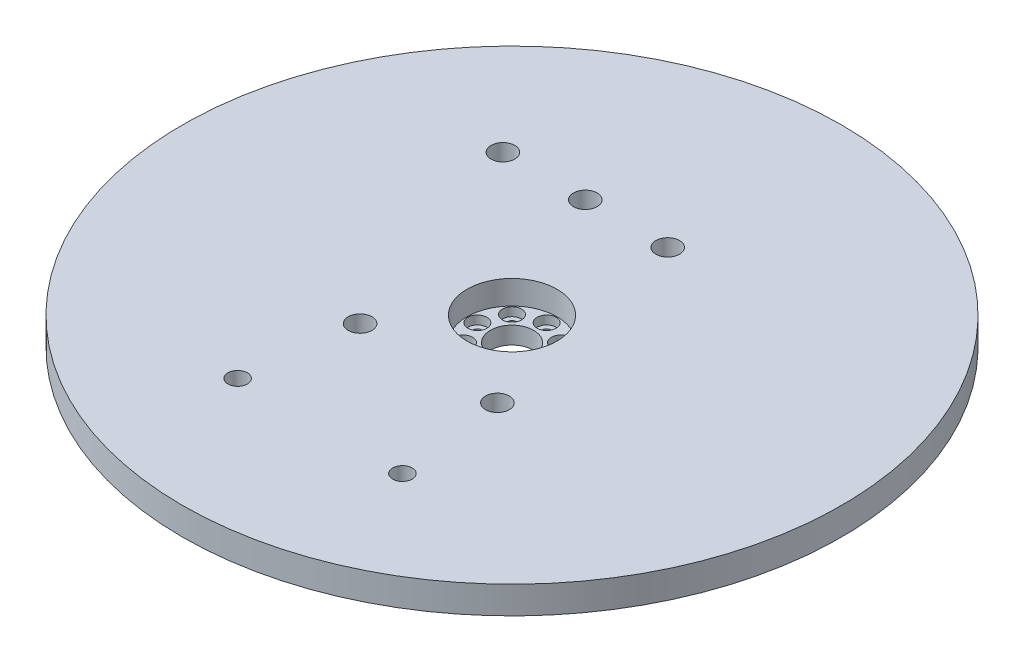
ISO-10303-21;
HEADER;
FILE_DESCRIPTION(('STEP AP214'),'2;1');
FILE_NAME('part.step','',(''),(''),'','','');
FILE_SCHEMA(('AUTOMOTIVE_DESIGN { 1 0 10303 214 1 1 1 1 }'));
ENDSEC;
DATA;
#1=APPLICATION_CONTEXT('core data for automotive mechanical design processes');
#2=APPLICATION_PROTOCOL_DEFINITION('international standard','automotive_design',2000,#1);
#3=PRODUCT_CONTEXT('',#1,'mechanical');
#4=PRODUCT('Part','Part','',(#3));
#5=PRODUCT_RELATED_PRODUCT_CATEGORY('part','',(#4));
#6=PRODUCT_DEFINITION_FORMATION('','',#4);
#7=PRODUCT_DEFINITION_CONTEXT('part definition',#1,'design');
#8=PRODUCT_DEFINITION('design','',#6,#7);
#9=PRODUCT_DEFINITION_SHAPE('','',#8);
#10=(LENGTH_UNIT() NAMED_UNIT(*) SI_UNIT(.MILLI.,.METRE.));
#11=(NAMED_UNIT(*) PLANE_ANGLE_UNIT() SI_UNIT($,.RADIAN.));
#12=(NAMED_UNIT(*) SI_UNIT($,.STERADIAN.) SOLID_ANGLE_UNIT());
#13=UNCERTAINTY_MEASURE_WITH_UNIT(LENGTH_MEASURE(1.E-05),#10,'distance_accuracy_value','');
#14=(GEOMETRIC_REPRESENTATION_CONTEXT(3) GLOBAL_UNCERTAINTY_ASSIGNED_CONTEXT((#13)) GLOBAL_UNIT_ASSIGNED_CONTEXT((#10,
#11,#12)) REPRESENTATION_CONTEXT('',''));
#15=CARTESIAN_POINT('',(0.,0.,0.));
#16=DIRECTION('',(0.,0.,1.));
#17=DIRECTION('',(1.,0.,0.));
#18=AXIS2_PLACEMENT_3D('',#15,#16,#17);
#19=CARTESIAN_POINT('',(0.,3.175,0.));
#20=DIRECTION('',(0.,-1.,0.));
#21=DIRECTION('',(0.,0.,-1.));
#22=AXIS2_PLACEMENT_3D('',#19,#20,#21);
#23=CYLINDRICAL_SURFACE('',#22,76.2);
#24=CARTESIAN_POINT('',(0.,3.175,0.));
#25=DIRECTION('',(0.,1.,0.));
#26=DIRECTION('',(0.,0.,1.));
#27=AXIS2_PLACEMENT_3D('',#24,#25,#26);
#28=CIRCLE('',#27,76.2);
#29=CARTESIAN_POINT('',(0.,3.175,76.2));
#30=VERTEX_POINT('',#29);
#31=EDGE_CURVE('E46',#30,#30,#28,.T.);
#32=ORIENTED_EDGE('',*,*,#31,.F.);
#33=EDGE_LOOP('',(#32));
#34=FACE_BOUND('',#33,.T.);
#35=CARTESIAN_POINT('',(0.,-3.175,0.));
#36=DIRECTION('',(0.,1.,0.));
#37=DIRECTION('',(0.,0.,1.));
#38=AXIS2_PLACEMENT_3D('',#35,#36,#37);
#39=CIRCLE('',#38,76.2);
#40=CARTESIAN_POINT('',(0.,-3.175,76.2));
#41=VERTEX_POINT('',#40);
#42=EDGE_CURVE('E51',#41,#41,#39,.T.);
#43=ORIENTED_EDGE('',*,*,#42,.T.);
#44=EDGE_LOOP('',(#43));
#45=FACE_BOUND('',#44,.T.);
#46=ADVANCED_FACE('F39',(#34,#45),#23,.T.);
#47=CARTESIAN_POINT('',(0.,3.175,0.));
#48=DIRECTION('',(0.,1.,0.));
#49=DIRECTION('',(0.,0.,1.));
#50=AXIS2_PLACEMENT_3D('',#47,#48,#49);
#51=PLANE('',#50);
#52=CARTESIAN_POINT('',(-33.6688086,3.175,-31.5673879519193));
#53=DIRECTION('',(0.,1.,0.));
#54=DIRECTION('',(0.,0.,1.));
#55=AXIS2_PLACEMENT_3D('',#52,#53,#54);
#56=CIRCLE('',#55,2.75);
#57=CARTESIAN_POINT('',(-33.6688086,3.175,-28.8173879519193));
#58=VERTEX_POINT('',#57);
#59=EDGE_CURVE('E117',#58,#58,#56,.T.);
#60=ORIENTED_EDGE('',*,*,#59,.F.);
#61=EDGE_LOOP('',(#60));
#62=FACE_BOUND('',#61,.T.);
#63=CARTESIAN_POINT('',(-14.6188085999999,3.175,-31.5673879519193));
#64=DIRECTION('',(0.,1.,0.));
#65=DIRECTION('',(0.,0.,1.));
#66=AXIS2_PLACEMENT_3D('',#63,#64,#65);
#67=CIRCLE('',#66,2.75);
#68=CARTESIAN_POINT('',(-14.6188085999999,3.175,-28.8173879519193));
#69=VERTEX_POINT('',#68);
#70=EDGE_CURVE('E106',#69,#69,#67,.T.);
#71=ORIENTED_EDGE('',*,*,#70,.F.);
#72=EDGE_LOOP('',(#71));
#73=FACE_BOUND('',#72,.T.);
#74=CARTESIAN_POINT('',(4.43119140000003,3.175,-31.5673879519193));
#75=DIRECTION('',(0.,1.,0.));
#76=DIRECTION('',(0.,0.,1.));
#77=AXIS2_PLACEMENT_3D('',#74,#75,#76);
#78=CIRCLE('',#77,2.75);
#79=CARTESIAN_POINT('',(4.43119140000003,3.175,-28.8173879519193));
#80=VERTEX_POINT('',#79);
#81=EDGE_CURVE('E105',#80,#80,#78,.T.);
#82=ORIENTED_EDGE('',*,*,#81,.F.);
#83=EDGE_LOOP('',(#82));
#84=FACE_BOUND('',#83,.T.);
#85=CARTESIAN_POINT('',(-15.875,3.175,19.2497064480786));
#86=DIRECTION('',(0.,1.,0.));
#87=DIRECTION('',(0.,0.,1.));
#88=AXIS2_PLACEMENT_3D('',#85,#86,#87);
#89=CIRCLE('',#88,2.75);
#90=CARTESIAN_POINT('',(-15.875,3.175,21.9997064480786));
#91=VERTEX_POINT('',#90);
#92=EDGE_CURVE('E122',#91,#91,#89,.T.);
#93=ORIENTED_EDGE('',*,*,#92,.F.);
#94=EDGE_LOOP('',(#93));
#95=FACE_BOUND('',#94,.T.);
#96=CARTESIAN_POINT('',(15.875,3.175,19.2497064480786));
#97=DIRECTION('',(0.,1.,0.));
#98=DIRECTION('',(0.,0.,1.));
#99=AXIS2_PLACEMENT_3D('',#96,#97,#98);
#100=CIRCLE('',#99,2.75);
#101=CARTESIAN_POINT('',(15.875,3.175,21.9997064480786));
#102=VERTEX_POINT('',#101);
#103=EDGE_CURVE('E102',#102,#102,#100,.T.);
#104=ORIENTED_EDGE('',*,*,#103,.F.);
#105=EDGE_LOOP('',(#104));
#106=FACE_BOUND('',#105,.T.);
#107=CARTESIAN_POINT('',(19.0500000000001,3.175,44.3882120480786));
#108=DIRECTION('',(0.,1.,0.));
#109=DIRECTION('',(0.,0.,1.));
#110=AXIS2_PLACEMENT_3D('',#107,#108,#109);
#111=CIRCLE('',#110,2.25);
#112=CARTESIAN_POINT('',(19.0500000000001,3.175,46.6382120480786));
#113=VERTEX_POINT('',#112);
#114=EDGE_CURVE('E101',#113,#113,#111,.T.);
#115=ORIENTED_EDGE('',*,*,#114,.F.);
#116=EDGE_LOOP('',(#115));
#117=FACE_BOUND('',#116,.T.);
#118=CARTESIAN_POINT('',(-19.0499999999999,3.175,44.3882120480786));
#119=DIRECTION('',(0.,1.,0.));
#120=DIRECTION('',(0.,0.,1.));
#121=AXIS2_PLACEMENT_3D('',#118,#119,#120);
#122=CIRCLE('',#121,2.25);
#123=CARTESIAN_POINT('',(-19.0499999999999,3.175,46.6382120480786));
#124=VERTEX_POINT('',#123);
#125=EDGE_CURVE('E135',#124,#124,#122,.T.);
#126=ORIENTED_EDGE('',*,*,#125,.F.);
#127=EDGE_LOOP('',(#126));
#128=FACE_BOUND('',#127,.T.);
#129=CARTESIAN_POINT('',(0.,3.175,0.));
#130=DIRECTION('',(0.,1.,0.));
#131=DIRECTION('',(0.,0.,1.));
#132=AXIS2_PLACEMENT_3D('',#129,#130,#131);
#133=CIRCLE('',#132,10.4);
#134=CARTESIAN_POINT('',(0.,3.175,10.4));
#135=VERTEX_POINT('',#134);
#136=EDGE_CURVE('E201',#135,#135,#133,.T.);
#137=ORIENTED_EDGE('',*,*,#136,.F.);
#138=EDGE_LOOP('',(#137));
#139=FACE_BOUND('',#138,.T.);
#140=ORIENTED_EDGE('',*,*,#31,.T.);
#141=EDGE_LOOP('',(#140));
#142=FACE_BOUND('',#141,.T.);
#143=ADVANCED_FACE('F226',(#62,#73,#84,#95,#106,#117,#128,#139,#142),#51,.T.);
#144=CARTESIAN_POINT('',(0.,-3.175,0.));
#145=DIRECTION('',(0.,1.,0.));
#146=DIRECTION('',(0.,0.,1.));
#147=AXIS2_PLACEMENT_3D('',#144,#145,#146);
#148=PLANE('',#147);
#149=CARTESIAN_POINT('',(-33.6688086,-3.175,-31.5673879519193));
#150=DIRECTION('',(0.,1.,0.));
#151=DIRECTION('',(0.,0.,1.));
#152=AXIS2_PLACEMENT_3D('',#149,#150,#151);
#153=CIRCLE('',#152,2.75);
#154=CARTESIAN_POINT('',(-33.6688086,-3.175,-28.8173879519193));
#155=VERTEX_POINT('',#154);
#156=EDGE_CURVE('E42',#155,#155,#153,.T.);
#157=ORIENTED_EDGE('',*,*,#156,.T.);
#158=EDGE_LOOP('',(#157));
#159=FACE_BOUND('',#158,.T.);
#160=CARTESIAN_POINT('',(-14.6188085999999,-3.175,-31.5673879519193));
#161=DIRECTION('',(0.,1.,0.));
#162=DIRECTION('',(0.,0.,1.));
#163=AXIS2_PLACEMENT_3D('',#160,#161,#162);
#164=CIRCLE('',#163,2.75);
#165=CARTESIAN_POINT('',(-14.6188085999999,-3.175,-28.8173879519193));
#166=VERTEX_POINT('',#165);
#167=EDGE_CURVE('E103',#166,#166,#164,.T.);
#168=ORIENTED_EDGE('',*,*,#167,.T.);
#169=EDGE_LOOP('',(#168));
#170=FACE_BOUND('',#169,.T.);
#171=CARTESIAN_POINT('',(4.43119140000003,-3.175,-31.5673879519193));
#172=DIRECTION('',(0.,1.,0.));
#173=DIRECTION('',(0.,0.,1.));
#174=AXIS2_PLACEMENT_3D('',#171,#172,#173);
#175=CIRCLE('',#174,2.75);
#176=CARTESIAN_POINT('',(4.43119140000003,-3.175,-28.8173879519193));
#177=VERTEX_POINT('',#176);
#178=EDGE_CURVE('E110',#177,#177,#175,.T.);
#179=ORIENTED_EDGE('',*,*,#178,.T.);
#180=EDGE_LOOP('',(#179));
#181=FACE_BOUND('',#180,.T.);
#182=CARTESIAN_POINT('',(-15.875,-3.175,19.2497064480786));
#183=DIRECTION('',(0.,1.,0.));
#184=DIRECTION('',(0.,0.,1.));
#185=AXIS2_PLACEMENT_3D('',#182,#183,#184);
#186=CIRCLE('',#185,2.75);
#187=CARTESIAN_POINT('',(-15.875,-3.175,21.9997064480786));
#188=VERTEX_POINT('',#187);
#189=EDGE_CURVE('E125',#188,#188,#186,.T.);
#190=ORIENTED_EDGE('',*,*,#189,.T.);
#191=EDGE_LOOP('',(#190));
#192=FACE_BOUND('',#191,.T.);
#193=CARTESIAN_POINT('',(15.875,-3.175,19.2497064480786));
#194=DIRECTION('',(0.,1.,0.));
#195=DIRECTION('',(0.,0.,1.));
#196=AXIS2_PLACEMENT_3D('',#193,#194,#195);
#197=CIRCLE('',#196,2.75);
#198=CARTESIAN_POINT('',(15.875,-3.175,21.9997064480786));
#199=VERTEX_POINT('',#198);
#200=EDGE_CURVE('E99',#199,#199,#197,.T.);
#201=ORIENTED_EDGE('',*,*,#200,.T.);
#202=EDGE_LOOP('',(#201));
#203=FACE_BOUND('',#202,.T.);
#204=CARTESIAN_POINT('',(19.0500000000001,-3.175,44.3882120480786));
#205=DIRECTION('',(0.,1.,0.));
#206=DIRECTION('',(0.,0.,1.));
#207=AXIS2_PLACEMENT_3D('',#204,#205,#206);
#208=CIRCLE('',#207,2.25);
#209=CARTESIAN_POINT('',(19.0500000000001,-3.175,46.6382120480786));
#210=VERTEX_POINT('',#209);
#211=EDGE_CURVE('E132',#210,#210,#208,.T.);
#212=ORIENTED_EDGE('',*,*,#211,.T.);
#213=EDGE_LOOP('',(#212));
#214=FACE_BOUND('',#213,.T.);
#215=CARTESIAN_POINT('',(-19.0499999999999,-3.175,44.3882120480786));
#216=DIRECTION('',(0.,1.,0.));
#217=DIRECTION('',(0.,0.,1.));
#218=AXIS2_PLACEMENT_3D('',#215,#216,#217);
#219=CIRCLE('',#218,2.25);
#220=CARTESIAN_POINT('',(-19.0499999999999,-3.175,46.6382120480786));
#221=VERTEX_POINT('',#220);
#222=EDGE_CURVE('E138',#221,#221,#219,.T.);
#223=ORIENTED_EDGE('',*,*,#222,.T.);
#224=EDGE_LOOP('',(#223));
#225=FACE_BOUND('',#224,.T.);
#226=CARTESIAN_POINT('',(0.,-3.175,0.));
#227=DIRECTION('',(0.,-1.,0.));
#228=DIRECTION('',(0.,0.,-1.));
#229=AXIS2_PLACEMENT_3D('',#226,#227,#228);
#230=CIRCLE('',#229,12.065);
#231=CARTESIAN_POINT('',(0.,-3.175,-12.065));
#232=VERTEX_POINT('',#231);
#233=EDGE_CURVE('E11',#232,#232,#230,.T.);
#234=ORIENTED_EDGE('',*,*,#233,.F.);
#235=EDGE_LOOP('',(#234));
#236=FACE_BOUND('',#235,.T.);
#237=ORIENTED_EDGE('',*,*,#42,.F.);
#238=EDGE_LOOP('',(#237));
#239=FACE_BOUND('',#238,.T.);
#240=ADVANCED_FACE('F216',(#159,#170,#181,#192,#203,#214,#225,#236,#239),#148,.F.);
#241=CARTESIAN_POINT('',(0.,-6.35,0.));
#242=DIRECTION('',(0.,1.,0.));
#243=DIRECTION('',(0.,0.,1.));
#244=AXIS2_PLACEMENT_3D('',#241,#242,#243);
#245=CYLINDRICAL_SURFACE('',#244,12.065);
#246=CARTESIAN_POINT('',(0.,-6.35,0.));
#247=DIRECTION('',(0.,-1.,0.));
#248=DIRECTION('',(0.,0.,-1.));
#249=AXIS2_PLACEMENT_3D('',#246,#247,#248);
#250=CIRCLE('',#249,12.065);
#251=CARTESIAN_POINT('',(0.,-6.35,-12.065));
#252=VERTEX_POINT('',#251);
#253=EDGE_CURVE('E54',#252,#252,#250,.T.);
#254=ORIENTED_EDGE('',*,*,#253,.F.);
#255=EDGE_LOOP('',(#254));
#256=FACE_BOUND('',#255,.T.);
#257=ORIENTED_EDGE('',*,*,#233,.T.);
#258=EDGE_LOOP('',(#257));
#259=FACE_BOUND('',#258,.T.);
#260=ADVANCED_FACE('F214',(#256,#259),#245,.T.);
#261=CARTESIAN_POINT('',(0.,-6.35,0.));
#262=DIRECTION('',(0.,-1.,0.));
#263=DIRECTION('',(0.,0.,-1.));
#264=AXIS2_PLACEMENT_3D('',#261,#262,#263);
#265=PLANE('',#264);
#266=CARTESIAN_POINT('',(-5.6568542495,-6.35,-5.6568542495));
#267=DIRECTION('',(0.,-1.,0.));
#268=DIRECTION('',(0.,0.,-1.));
#269=AXIS2_PLACEMENT_3D('',#266,#267,#268);
#270=CIRCLE('',#269,1.1);
#271=CARTESIAN_POINT('',(-5.6568542495,-6.35,-6.7568542495));
#272=VERTEX_POINT('',#271);
#273=EDGE_CURVE('E94',#272,#272,#270,.T.);
#274=ORIENTED_EDGE('',*,*,#273,.F.);
#275=EDGE_LOOP('',(#274));
#276=FACE_BOUND('',#275,.T.);
#277=CARTESIAN_POINT('',(0.,-6.35,-8.));
#278=DIRECTION('',(0.,-1.,0.));
#279=DIRECTION('',(0.,0.,-1.));
#280=AXIS2_PLACEMENT_3D('',#277,#278,#279);
#281=CIRCLE('',#280,1.1);
#282=CARTESIAN_POINT('',(0.,-6.35,-9.1));
#283=VERTEX_POINT('',#282);
#284=EDGE_CURVE('E89',#283,#283,#281,.T.);
#285=ORIENTED_EDGE('',*,*,#284,.F.);
#286=EDGE_LOOP('',(#285));
#287=FACE_BOUND('',#286,.T.);
#288=CARTESIAN_POINT('',(5.6568542495,-6.35,-5.6568542495));
#289=DIRECTION('',(0.,-1.,0.));
#290=DIRECTION('',(0.,0.,-1.));
#291=AXIS2_PLACEMENT_3D('',#288,#289,#290);
#292=CIRCLE('',#291,1.1);
#293=CARTESIAN_POINT('',(5.6568542495,-6.35,-6.7568542495));
#294=VERTEX_POINT('',#293);
#295=EDGE_CURVE('E84',#294,#294,#292,.T.);
#296=ORIENTED_EDGE('',*,*,#295,.F.);
#297=EDGE_LOOP('',(#296));
#298=FACE_BOUND('',#297,.T.);
#299=CARTESIAN_POINT('',(8.,-6.35,0.));
#300=DIRECTION('',(0.,-1.,0.));
#301=DIRECTION('',(0.,0.,-1.));
#302=AXIS2_PLACEMENT_3D('',#299,#300,#301);
#303=CIRCLE('',#302,1.1);
#304=CARTESIAN_POINT('',(8.,-6.35,-1.1));
#305=VERTEX_POINT('',#304);
#306=EDGE_CURVE('E79',#305,#305,#303,.T.);
#307=ORIENTED_EDGE('',*,*,#306,.F.);
#308=EDGE_LOOP('',(#307));
#309=FACE_BOUND('',#308,.T.);
#310=CARTESIAN_POINT('',(5.6568542495,-6.35,5.6568542495));
#311=DIRECTION('',(0.,-1.,0.));
#312=DIRECTION('',(0.,0.,-1.));
#313=AXIS2_PLACEMENT_3D('',#310,#311,#312);
#314=CIRCLE('',#313,1.1);
#315=CARTESIAN_POINT('',(5.6568542495,-6.35,4.5568542495));
#316=VERTEX_POINT('',#315);
#317=EDGE_CURVE('E74',#316,#316,#314,.T.);
#318=ORIENTED_EDGE('',*,*,#317,.F.);
#319=EDGE_LOOP('',(#318));
#320=FACE_BOUND('',#319,.T.);
#321=CARTESIAN_POINT('',(0.,-6.35,8.));
#322=DIRECTION('',(0.,-1.,0.));
#323=DIRECTION('',(0.,0.,-1.));
#324=AXIS2_PLACEMENT_3D('',#321,#322,#323);
#325=CIRCLE('',#324,1.1);
#326=CARTESIAN_POINT('',(0.,-6.35,6.9));
#327=VERTEX_POINT('',#326);
#328=EDGE_CURVE('E69',#327,#327,#325,.T.);
#329=ORIENTED_EDGE('',*,*,#328,.F.);
#330=EDGE_LOOP('',(#329));
#331=FACE_BOUND('',#330,.T.);
#332=CARTESIAN_POINT('',(-5.6568542495,-6.35,5.6568542495));
#333=DIRECTION('',(0.,-1.,0.));
#334=DIRECTION('',(0.,0.,-1.));
#335=AXIS2_PLACEMENT_3D('',#332,#333,#334);
#336=CIRCLE('',#335,1.1);
#337=CARTESIAN_POINT('',(-5.6568542495,-6.35,4.5568542495));
#338=VERTEX_POINT('',#337);
#339=EDGE_CURVE('E64',#338,#338,#336,.T.);
#340=ORIENTED_EDGE('',*,*,#339,.F.);
#341=EDGE_LOOP('',(#340));
#342=FACE_BOUND('',#341,.T.);
#343=CARTESIAN_POINT('',(-8.,-6.35,0.));
#344=DIRECTION('',(0.,-1.,0.));
#345=DIRECTION('',(0.,0.,-1.));
#346=AXIS2_PLACEMENT_3D('',#343,#344,#345);
#347=CIRCLE('',#346,1.1);
#348=CARTESIAN_POINT('',(-8.,-6.35,-1.1));
#349=VERTEX_POINT('',#348);
#350=EDGE_CURVE('E59',#349,#349,#347,.T.);
#351=ORIENTED_EDGE('',*,*,#350,.F.);
#352=EDGE_LOOP('',(#351));
#353=FACE_BOUND('',#352,.T.);
#354=CARTESIAN_POINT('',(0.,-6.35,0.));
#355=DIRECTION('',(0.,-1.,0.));
#356=DIRECTION('',(0.,0.,-1.));
#357=AXIS2_PLACEMENT_3D('',#354,#355,#356);
#358=CIRCLE('',#357,5.);
#359=CARTESIAN_POINT('',(0.,-6.35,-5.));
#360=VERTEX_POINT('',#359);
#361=EDGE_CURVE('E62',#360,#360,#358,.F.);
#362=ORIENTED_EDGE('',*,*,#361,.T.);
#363=EDGE_LOOP('',(#362));
#364=FACE_BOUND('',#363,.T.);
#365=ORIENTED_EDGE('',*,*,#253,.T.);
#366=EDGE_LOOP('',(#365));
#367=FACE_BOUND('',#366,.T.);
#368=ADVANCED_FACE('F212',(#276,#287,#298,#309,#320,#331,#342,#353,#364,#367),#265,.T.);
#369=CARTESIAN_POINT('',(0.,-2.35,0.));
#370=DIRECTION('',(0.,-1.,0.));
#371=DIRECTION('',(0.,0.,-1.));
#372=AXIS2_PLACEMENT_3D('',#369,#370,#371);
#373=PLANE('',#372);
#374=CARTESIAN_POINT('',(-5.6568542495,-2.35,-5.6568542495));
#375=DIRECTION('',(0.,1.,0.));
#376=DIRECTION('',(0.,0.,1.));
#377=AXIS2_PLACEMENT_3D('',#374,#375,#376);
#378=CIRCLE('',#377,2.19999999999999);
#379=CARTESIAN_POINT('',(-5.6568542495,-2.35,-3.45685424950001));
#380=VERTEX_POINT('',#379);
#381=EDGE_CURVE('E141',#380,#380,#378,.T.);
#382=ORIENTED_EDGE('',*,*,#381,.F.);
#383=EDGE_LOOP('',(#382));
#384=FACE_BOUND('',#383,.T.);
#385=CARTESIAN_POINT('',(0.,-2.35,-8.));
#386=DIRECTION('',(0.,1.,0.));
#387=DIRECTION('',(0.,0.,1.));
#388=AXIS2_PLACEMENT_3D('',#385,#386,#387);
#389=CIRCLE('',#388,2.19999999999999);
#390=CARTESIAN_POINT('',(0.,-2.35,-5.80000000000001));
#391=VERTEX_POINT('',#390);
#392=EDGE_CURVE('E97',#391,#391,#389,.T.);
#393=ORIENTED_EDGE('',*,*,#392,.F.);
#394=EDGE_LOOP('',(#393));
#395=FACE_BOUND('',#394,.T.);
#396=CARTESIAN_POINT('',(5.6568542495,-2.35,-5.6568542495));
#397=DIRECTION('',(0.,1.,0.));
#398=DIRECTION('',(0.,0.,1.));
#399=AXIS2_PLACEMENT_3D('',#396,#397,#398);
#400=CIRCLE('',#399,2.19999999999999);
#401=CARTESIAN_POINT('',(5.6568542495,-2.35,-3.45685424950001));
#402=VERTEX_POINT('',#401);
#403=EDGE_CURVE('E92',#402,#402,#400,.T.);
#404=ORIENTED_EDGE('',*,*,#403,.F.);
#405=EDGE_LOOP('',(#404));
#406=FACE_BOUND('',#405,.T.);
#407=CARTESIAN_POINT('',(8.,-2.35,0.));
#408=DIRECTION('',(0.,1.,0.));
#409=DIRECTION('',(0.,0.,1.));
#410=AXIS2_PLACEMENT_3D('',#407,#408,#409);
#411=CIRCLE('',#410,2.19999999999999);
#412=CARTESIAN_POINT('',(8.,-2.35,2.19999999999999));
#413=VERTEX_POINT('',#412);
#414=EDGE_CURVE('E87',#413,#413,#411,.T.);
#415=ORIENTED_EDGE('',*,*,#414,.F.);
#416=EDGE_LOOP('',(#415));
#417=FACE_BOUND('',#416,.T.);
#418=CARTESIAN_POINT('',(5.6568542495,-2.35,5.6568542495));
#419=DIRECTION('',(0.,1.,0.));
#420=DIRECTION('',(0.,0.,1.));
#421=AXIS2_PLACEMENT_3D('',#418,#419,#420);
#422=CIRCLE('',#421,2.19999999999999);
#423=CARTESIAN_POINT('',(5.6568542495,-2.35,7.85685424949999));
#424=VERTEX_POINT('',#423);
#425=EDGE_CURVE('E82',#424,#424,#422,.T.);
#426=ORIENTED_EDGE('',*,*,#425,.F.);
#427=EDGE_LOOP('',(#426));
#428=FACE_BOUND('',#427,.T.);
#429=CARTESIAN_POINT('',(0.,-2.35,8.));
#430=DIRECTION('',(0.,1.,0.));
#431=DIRECTION('',(0.,0.,1.));
#432=AXIS2_PLACEMENT_3D('',#429,#430,#431);
#433=CIRCLE('',#432,2.19999999999999);
#434=CARTESIAN_POINT('',(0.,-2.35,10.2));
#435=VERTEX_POINT('',#434);
#436=EDGE_CURVE('E77',#435,#435,#433,.T.);
#437=ORIENTED_EDGE('',*,*,#436,.F.);
#438=EDGE_LOOP('',(#437));
#439=FACE_BOUND('',#438,.T.);
#440=CARTESIAN_POINT('',(-5.6568542495,-2.35,5.6568542495));
#441=DIRECTION('',(0.,1.,0.));
#442=DIRECTION('',(0.,0.,1.));
#443=AXIS2_PLACEMENT_3D('',#440,#441,#442);
#444=CIRCLE('',#443,2.19999999999999);
#445=CARTESIAN_POINT('',(-5.6568542495,-2.35,7.85685424949999));
#446=VERTEX_POINT('',#445);
#447=EDGE_CURVE('E72',#446,#446,#444,.T.);
#448=ORIENTED_EDGE('',*,*,#447,.F.);
#449=EDGE_LOOP('',(#448));
#450=FACE_BOUND('',#449,.T.);
#451=CARTESIAN_POINT('',(-8.,-2.35,0.));
#452=DIRECTION('',(0.,1.,0.));
#453=DIRECTION('',(0.,0.,1.));
#454=AXIS2_PLACEMENT_3D('',#451,#452,#453);
#455=CIRCLE('',#454,2.19999999999999);
#456=CARTESIAN_POINT('',(-8.,-2.35,2.19999999999999));
#457=VERTEX_POINT('',#456);
#458=EDGE_CURVE('E67',#457,#457,#455,.T.);
#459=ORIENTED_EDGE('',*,*,#458,.F.);
#460=EDGE_LOOP('',(#459));
#461=FACE_BOUND('',#460,.T.);
#462=CARTESIAN_POINT('',(0.,-2.35,0.));
#463=DIRECTION('',(0.,1.,0.));
#464=DIRECTION('',(0.,0.,1.));
#465=AXIS2_PLACEMENT_3D('',#462,#463,#464);
#466=CIRCLE('',#465,5.);
#467=CARTESIAN_POINT('',(0.,-2.35,5.));
#468=VERTEX_POINT('',#467);
#469=EDGE_CURVE('E198',#468,#468,#466,.T.);
#470=ORIENTED_EDGE('',*,*,#469,.F.);
#471=EDGE_LOOP('',(#470));
#472=FACE_BOUND('',#471,.T.);
#473=CARTESIAN_POINT('',(0.,-2.35,0.));
#474=DIRECTION('',(0.,-1.,0.));
#475=DIRECTION('',(0.,0.,-1.));
#476=AXIS2_PLACEMENT_3D('',#473,#474,#475);
#477=CIRCLE('',#476,10.4);
#478=CARTESIAN_POINT('',(0.,-2.35,-10.4));
#479=VERTEX_POINT('',#478);
#480=EDGE_CURVE('E205',#479,#479,#477,.F.);
#481=ORIENTED_EDGE('',*,*,#480,.T.);
#482=EDGE_LOOP('',(#481));
#483=FACE_BOUND('',#482,.T.);
#484=ADVANCED_FACE('F222',(#384,#395,#406,#417,#428,#439,#450,#461,#472,#483),#373,.F.);
#485=CARTESIAN_POINT('',(0.,-35.7656420973604,0.));
#486=DIRECTION('',(0.,1.,0.));
#487=DIRECTION('',(0.,0.,1.));
#488=AXIS2_PLACEMENT_3D('',#485,#486,#487);
#489=CYLINDRICAL_SURFACE('',#488,10.4);
#490=ORIENTED_EDGE('',*,*,#136,.T.);
#491=EDGE_LOOP('',(#490));
#492=FACE_BOUND('',#491,.T.);
#493=ORIENTED_EDGE('',*,*,#480,.F.);
#494=EDGE_LOOP('',(#493));
#495=FACE_BOUND('',#494,.T.);
#496=ADVANCED_FACE('F259',(#492,#495),#489,.F.);
#497=CARTESIAN_POINT('',(0.,-6.351,0.));
#498=DIRECTION('',(0.,1.,0.));
#499=DIRECTION('',(0.,0.,1.));
#500=AXIS2_PLACEMENT_3D('',#497,#498,#499);
#501=CYLINDRICAL_SURFACE('',#500,5.);
#502=ORIENTED_EDGE('',*,*,#361,.F.);
#503=EDGE_LOOP('',(#502));
#504=FACE_BOUND('',#503,.T.);
#505=ORIENTED_EDGE('',*,*,#469,.T.);
#506=EDGE_LOOP('',(#505));
#507=FACE_BOUND('',#506,.T.);
#508=ADVANCED_FACE('F262',(#504,#507),#501,.F.);
#509=CARTESIAN_POINT('',(-8.,-2.35,0.));
#510=DIRECTION('',(0.,1.,0.));
#511=DIRECTION('',(0.,0.,1.));
#512=AXIS2_PLACEMENT_3D('',#509,#510,#511);
#513=CYLINDRICAL_SURFACE('',#512,1.1);
#514=ORIENTED_EDGE('',*,*,#350,.T.);
#515=EDGE_LOOP('',(#514));
#516=FACE_BOUND('',#515,.T.);
#517=CARTESIAN_POINT('',(-8.,-4.35,0.));
#518=DIRECTION('',(0.,1.,0.));
#519=DIRECTION('',(0.,0.,1.));
#520=AXIS2_PLACEMENT_3D('',#517,#518,#519);
#521=CIRCLE('',#520,1.1);
#522=CARTESIAN_POINT('',(-8.,-4.35,1.1));
#523=VERTEX_POINT('',#522);
#524=EDGE_CURVE('E63',#523,#523,#521,.T.);
#525=ORIENTED_EDGE('',*,*,#524,.T.);
#526=EDGE_LOOP('',(#525));
#527=FACE_BOUND('',#526,.T.);
#528=ADVANCED_FACE('F268',(#516,#527),#513,.F.);
#529=CARTESIAN_POINT('',(-6.9,-4.35,0.));
#530=DIRECTION('',(0.,-1.,0.));
#531=DIRECTION('',(0.,0.,-1.));
#532=AXIS2_PLACEMENT_3D('',#529,#530,#531);
#533=PLANE('',#532);
#534=ORIENTED_EDGE('',*,*,#524,.F.);
#535=EDGE_LOOP('',(#534));
#536=FACE_BOUND('',#535,.T.);
#537=CARTESIAN_POINT('',(-8.,-4.35,0.));
#538=DIRECTION('',(0.,1.,0.));
#539=DIRECTION('',(0.,0.,1.));
#540=AXIS2_PLACEMENT_3D('',#537,#538,#539);
#541=CIRCLE('',#540,2.2);
#542=CARTESIAN_POINT('',(-8.,-4.35,2.2));
#543=VERTEX_POINT('',#542);
#544=EDGE_CURVE('E193',#543,#543,#541,.T.);
#545=ORIENTED_EDGE('',*,*,#544,.T.);
#546=EDGE_LOOP('',(#545));
#547=FACE_BOUND('',#546,.T.);
#548=ADVANCED_FACE('F276',(#536,#547),#533,.F.);
#549=CARTESIAN_POINT('',(-8.,-2.35,0.));
#550=DIRECTION('',(0.,1.,0.));
#551=DIRECTION('',(0.,0.,1.));
#552=AXIS2_PLACEMENT_3D('',#549,#550,#551);
#553=CYLINDRICAL_SURFACE('',#552,2.19999999999999);
#554=ORIENTED_EDGE('',*,*,#544,.F.);
#555=EDGE_LOOP('',(#554));
#556=FACE_BOUND('',#555,.T.);
#557=ORIENTED_EDGE('',*,*,#458,.T.);
#558=EDGE_LOOP('',(#557));
#559=FACE_BOUND('',#558,.T.);
#560=ADVANCED_FACE('F280',(#556,#559),#553,.F.);
#561=CARTESIAN_POINT('',(-5.6568542495,-2.35,5.6568542495));
#562=DIRECTION('',(0.,1.,0.));
#563=DIRECTION('',(0.,0.,1.));
#564=AXIS2_PLACEMENT_3D('',#561,#562,#563);
#565=CYLINDRICAL_SURFACE('',#564,1.1);
#566=ORIENTED_EDGE('',*,*,#339,.T.);
#567=EDGE_LOOP('',(#566));
#568=FACE_BOUND('',#567,.T.);
#569=CARTESIAN_POINT('',(-5.6568542495,-4.35,5.6568542495));
#570=DIRECTION('',(0.,1.,0.));
#571=DIRECTION('',(0.,0.,1.));
#572=AXIS2_PLACEMENT_3D('',#569,#570,#571);
#573=CIRCLE('',#572,1.1);
#574=CARTESIAN_POINT('',(-5.6568542495,-4.35,6.7568542495));
#575=VERTEX_POINT('',#574);
#576=EDGE_CURVE('E68',#575,#575,#573,.T.);
#577=ORIENTED_EDGE('',*,*,#576,.T.);
#578=EDGE_LOOP('',(#577));
#579=FACE_BOUND('',#578,.T.);
#580=ADVANCED_FACE('F284',(#568,#579),#565,.F.);
#581=CARTESIAN_POINT('',(-4.5568542495,-4.35,5.6568542495));
#582=DIRECTION('',(0.,-1.,0.));
#583=DIRECTION('',(0.,0.,-1.));
#584=AXIS2_PLACEMENT_3D('',#581,#582,#583);
#585=PLANE('',#584);
#586=ORIENTED_EDGE('',*,*,#576,.F.);
#587=EDGE_LOOP('',(#586));
#588=FACE_BOUND('',#587,.T.);
#589=CARTESIAN_POINT('',(-5.6568542495,-4.35,5.6568542495));
#590=DIRECTION('',(0.,1.,0.));
#591=DIRECTION('',(0.,0.,1.));
#592=AXIS2_PLACEMENT_3D('',#589,#590,#591);
#593=CIRCLE('',#592,2.2);
#594=CARTESIAN_POINT('',(-5.6568542495,-4.35,7.8568542495));
#595=VERTEX_POINT('',#594);
#596=EDGE_CURVE('E186',#595,#595,#593,.T.);
#597=ORIENTED_EDGE('',*,*,#596,.T.);
#598=EDGE_LOOP('',(#597));
#599=FACE_BOUND('',#598,.T.);
#600=ADVANCED_FACE('F288',(#588,#599),#585,.F.);
#601=CARTESIAN_POINT('',(-5.6568542495,-2.35,5.6568542495));
#602=DIRECTION('',(0.,1.,0.));
#603=DIRECTION('',(0.,0.,1.));
#604=AXIS2_PLACEMENT_3D('',#601,#602,#603);
#605=CYLINDRICAL_SURFACE('',#604,2.19999999999999);
#606=ORIENTED_EDGE('',*,*,#596,.F.);
#607=EDGE_LOOP('',(#606));
#608=FACE_BOUND('',#607,.T.);
#609=ORIENTED_EDGE('',*,*,#447,.T.);
#610=EDGE_LOOP('',(#609));
#611=FACE_BOUND('',#610,.T.);
#612=ADVANCED_FACE('F292',(#608,#611),#605,.F.);
#613=CARTESIAN_POINT('',(0.,-2.35,8.));
#614=DIRECTION('',(0.,1.,0.));
#615=DIRECTION('',(0.,0.,1.));
#616=AXIS2_PLACEMENT_3D('',#613,#614,#615);
#617=CYLINDRICAL_SURFACE('',#616,1.1);
#618=ORIENTED_EDGE('',*,*,#328,.T.);
#619=EDGE_LOOP('',(#618));
#620=FACE_BOUND('',#619,.T.);
#621=CARTESIAN_POINT('',(0.,-4.35,8.));
#622=DIRECTION('',(0.,1.,0.));
#623=DIRECTION('',(0.,0.,1.));
#624=AXIS2_PLACEMENT_3D('',#621,#622,#623);
#625=CIRCLE('',#624,1.1);
#626=CARTESIAN_POINT('',(0.,-4.35,9.1));
#627=VERTEX_POINT('',#626);
#628=EDGE_CURVE('E73',#627,#627,#625,.T.);
#629=ORIENTED_EDGE('',*,*,#628,.T.);
#630=EDGE_LOOP('',(#629));
#631=FACE_BOUND('',#630,.T.);
#632=ADVANCED_FACE('F296',(#620,#631),#617,.F.);
#633=CARTESIAN_POINT('',(1.1,-4.35,8.));
#634=DIRECTION('',(0.,-1.,0.));
#635=DIRECTION('',(0.,0.,-1.));
#636=AXIS2_PLACEMENT_3D('',#633,#634,#635);
#637=PLANE('',#636);
#638=ORIENTED_EDGE('',*,*,#628,.F.);
#639=EDGE_LOOP('',(#638));
#640=FACE_BOUND('',#639,.T.);
#641=CARTESIAN_POINT('',(0.,-4.35,8.));
#642=DIRECTION('',(0.,1.,0.));
#643=DIRECTION('',(0.,0.,1.));
#644=AXIS2_PLACEMENT_3D('',#641,#642,#643);
#645=CIRCLE('',#644,2.2);
#646=CARTESIAN_POINT('',(0.,-4.35,10.2));
#647=VERTEX_POINT('',#646);
#648=EDGE_CURVE('E179',#647,#647,#645,.T.);
#649=ORIENTED_EDGE('',*,*,#648,.T.);
#650=EDGE_LOOP('',(#649));
#651=FACE_BOUND('',#650,.T.);
#652=ADVANCED_FACE('F300',(#640,#651),#637,.F.);
#653=CARTESIAN_POINT('',(0.,-2.35,8.));
#654=DIRECTION('',(0.,1.,0.));
#655=DIRECTION('',(0.,0.,1.));
#656=AXIS2_PLACEMENT_3D('',#653,#654,#655);
#657=CYLINDRICAL_SURFACE('',#656,2.19999999999999);
#658=ORIENTED_EDGE('',*,*,#648,.F.);
#659=EDGE_LOOP('',(#658));
#660=FACE_BOUND('',#659,.T.);
#661=ORIENTED_EDGE('',*,*,#436,.T.);
#662=EDGE_LOOP('',(#661));
#663=FACE_BOUND('',#662,.T.);
#664=ADVANCED_FACE('F304',(#660,#663),#657,.F.);
#665=CARTESIAN_POINT('',(5.6568542495,-2.35,5.6568542495));
#666=DIRECTION('',(0.,1.,0.));
#667=DIRECTION('',(0.,0.,1.));
#668=AXIS2_PLACEMENT_3D('',#665,#666,#667);
#669=CYLINDRICAL_SURFACE('',#668,1.1);
#670=ORIENTED_EDGE('',*,*,#317,.T.);
#671=EDGE_LOOP('',(#670));
#672=FACE_BOUND('',#671,.T.);
#673=CARTESIAN_POINT('',(5.6568542495,-4.35,5.6568542495));
#674=DIRECTION('',(0.,1.,0.));
#675=DIRECTION('',(0.,0.,1.));
#676=AXIS2_PLACEMENT_3D('',#673,#674,#675);
#677=CIRCLE('',#676,1.1);
#678=CARTESIAN_POINT('',(5.6568542495,-4.35,6.7568542495));
#679=VERTEX_POINT('',#678);
#680=EDGE_CURVE('E78',#679,#679,#677,.T.);
#681=ORIENTED_EDGE('',*,*,#680,.T.);
#682=EDGE_LOOP('',(#681));
#683=FACE_BOUND('',#682,.T.);
#684=ADVANCED_FACE('F308',(#672,#683),#669,.F.);
#685=CARTESIAN_POINT('',(6.7568542495,-4.35,5.6568542495));
#686=DIRECTION('',(0.,-1.,0.));
#687=DIRECTION('',(0.,0.,-1.));
#688=AXIS2_PLACEMENT_3D('',#685,#686,#687);
#689=PLANE('',#688);
#690=ORIENTED_EDGE('',*,*,#680,.F.);
#691=EDGE_LOOP('',(#690));
#692=FACE_BOUND('',#691,.T.);
#693=CARTESIAN_POINT('',(5.6568542495,-4.35,5.6568542495));
#694=DIRECTION('',(0.,1.,0.));
#695=DIRECTION('',(0.,0.,1.));
#696=AXIS2_PLACEMENT_3D('',#693,#694,#695);
#697=CIRCLE('',#696,2.2);
#698=CARTESIAN_POINT('',(5.6568542495,-4.35,7.8568542495));
#699=VERTEX_POINT('',#698);
#700=EDGE_CURVE('E172',#699,#699,#697,.T.);
#701=ORIENTED_EDGE('',*,*,#700,.T.);
#702=EDGE_LOOP('',(#701));
#703=FACE_BOUND('',#702,.T.);
#704=ADVANCED_FACE('F312',(#692,#703),#689,.F.);
#705=CARTESIAN_POINT('',(5.6568542495,-2.35,5.6568542495));
#706=DIRECTION('',(0.,1.,0.));
#707=DIRECTION('',(0.,0.,1.));
#708=AXIS2_PLACEMENT_3D('',#705,#706,#707);
#709=CYLINDRICAL_SURFACE('',#708,2.19999999999999);
#710=ORIENTED_EDGE('',*,*,#700,.F.);
#711=EDGE_LOOP('',(#710));
#712=FACE_BOUND('',#711,.T.);
#713=ORIENTED_EDGE('',*,*,#425,.T.);
#714=EDGE_LOOP('',(#713));
#715=FACE_BOUND('',#714,.T.);
#716=ADVANCED_FACE('F316',(#712,#715),#709,.F.);
#717=CARTESIAN_POINT('',(8.,-2.35,0.));
#718=DIRECTION('',(0.,1.,0.));
#719=DIRECTION('',(0.,0.,1.));
#720=AXIS2_PLACEMENT_3D('',#717,#718,#719);
#721=CYLINDRICAL_SURFACE('',#720,1.1);
#722=ORIENTED_EDGE('',*,*,#306,.T.);
#723=EDGE_LOOP('',(#722));
#724=FACE_BOUND('',#723,.T.);
#725=CARTESIAN_POINT('',(8.,-4.35,0.));
#726=DIRECTION('',(0.,1.,0.));
#727=DIRECTION('',(0.,0.,1.));
#728=AXIS2_PLACEMENT_3D('',#725,#726,#727);
#729=CIRCLE('',#728,1.1);
#730=CARTESIAN_POINT('',(8.,-4.35,1.1));
#731=VERTEX_POINT('',#730);
#732=EDGE_CURVE('E83',#731,#731,#729,.T.);
#733=ORIENTED_EDGE('',*,*,#732,.T.);
#734=EDGE_LOOP('',(#733));
#735=FACE_BOUND('',#734,.T.);
#736=ADVANCED_FACE('F320',(#724,#735),#721,.F.);
#737=CARTESIAN_POINT('',(9.1,-4.35,0.));
#738=DIRECTION('',(0.,-1.,0.));
#739=DIRECTION('',(0.,0.,-1.));
#740=AXIS2_PLACEMENT_3D('',#737,#738,#739);
#741=PLANE('',#740);
#742=ORIENTED_EDGE('',*,*,#732,.F.);
#743=EDGE_LOOP('',(#742));
#744=FACE_BOUND('',#743,.T.);
#745=CARTESIAN_POINT('',(8.,-4.35,0.));
#746=DIRECTION('',(0.,1.,0.));
#747=DIRECTION('',(0.,0.,1.));
#748=AXIS2_PLACEMENT_3D('',#745,#746,#747);
#749=CIRCLE('',#748,2.2);
#750=CARTESIAN_POINT('',(8.,-4.35,2.2));
#751=VERTEX_POINT('',#750);
#752=EDGE_CURVE('E165',#751,#751,#749,.T.);
#753=ORIENTED_EDGE('',*,*,#752,.T.);
#754=EDGE_LOOP('',(#753));
#755=FACE_BOUND('',#754,.T.);
#756=ADVANCED_FACE('F324',(#744,#755),#741,.F.);
#757=CARTESIAN_POINT('',(8.,-2.35,0.));
#758=DIRECTION('',(0.,1.,0.));
#759=DIRECTION('',(0.,0.,1.));
#760=AXIS2_PLACEMENT_3D('',#757,#758,#759);
#761=CYLINDRICAL_SURFACE('',#760,2.2);
#762=ORIENTED_EDGE('',*,*,#752,.F.);
#763=EDGE_LOOP('',(#762));
#764=FACE_BOUND('',#763,.T.);
#765=ORIENTED_EDGE('',*,*,#414,.T.);
#766=EDGE_LOOP('',(#765));
#767=FACE_BOUND('',#766,.T.);
#768=ADVANCED_FACE('F328',(#764,#767),#761,.F.);
#769=CARTESIAN_POINT('',(5.6568542495,-2.35,-5.6568542495));
#770=DIRECTION('',(0.,1.,0.));
#771=DIRECTION('',(0.,0.,1.));
#772=AXIS2_PLACEMENT_3D('',#769,#770,#771);
#773=CYLINDRICAL_SURFACE('',#772,1.1);
#774=ORIENTED_EDGE('',*,*,#295,.T.);
#775=EDGE_LOOP('',(#774));
#776=FACE_BOUND('',#775,.T.);
#777=CARTESIAN_POINT('',(5.6568542495,-4.35,-5.6568542495));
#778=DIRECTION('',(0.,1.,0.));
#779=DIRECTION('',(0.,0.,1.));
#780=AXIS2_PLACEMENT_3D('',#777,#778,#779);
#781=CIRCLE('',#780,1.1);
#782=CARTESIAN_POINT('',(5.6568542495,-4.35,-4.5568542495));
#783=VERTEX_POINT('',#782);
#784=EDGE_CURVE('E88',#783,#783,#781,.T.);
#785=ORIENTED_EDGE('',*,*,#784,.T.);
#786=EDGE_LOOP('',(#785));
#787=FACE_BOUND('',#786,.T.);
#788=ADVANCED_FACE('F332',(#776,#787),#773,.F.);
#789=CARTESIAN_POINT('',(6.7568542495,-4.35,-5.6568542495));
#790=DIRECTION('',(0.,-1.,0.));
#791=DIRECTION('',(0.,0.,-1.));
#792=AXIS2_PLACEMENT_3D('',#789,#790,#791);
#793=PLANE('',#792);
#794=ORIENTED_EDGE('',*,*,#784,.F.);
#795=EDGE_LOOP('',(#794));
#796=FACE_BOUND('',#795,.T.);
#797=CARTESIAN_POINT('',(5.6568542495,-4.35,-5.6568542495));
#798=DIRECTION('',(0.,1.,0.));
#799=DIRECTION('',(0.,0.,1.));
#800=AXIS2_PLACEMENT_3D('',#797,#798,#799);
#801=CIRCLE('',#800,2.2);
#802=CARTESIAN_POINT('',(5.6568542495,-4.35,-3.4568542495));
#803=VERTEX_POINT('',#802);
#804=EDGE_CURVE('E158',#803,#803,#801,.T.);
#805=ORIENTED_EDGE('',*,*,#804,.T.);
#806=EDGE_LOOP('',(#805));
#807=FACE_BOUND('',#806,.T.);
#808=ADVANCED_FACE('F336',(#796,#807),#793,.F.);
#809=CARTESIAN_POINT('',(5.6568542495,-2.35,-5.6568542495));
#810=DIRECTION('',(0.,1.,0.));
#811=DIRECTION('',(0.,0.,1.));
#812=AXIS2_PLACEMENT_3D('',#809,#810,#811);
#813=CYLINDRICAL_SURFACE('',#812,2.19999999999999);
#814=ORIENTED_EDGE('',*,*,#804,.F.);
#815=EDGE_LOOP('',(#814));
#816=FACE_BOUND('',#815,.T.);
#817=ORIENTED_EDGE('',*,*,#403,.T.);
#818=EDGE_LOOP('',(#817));
#819=FACE_BOUND('',#818,.T.);
#820=ADVANCED_FACE('F340',(#816,#819),#813,.F.);
#821=CARTESIAN_POINT('',(0.,-2.35,-8.));
#822=DIRECTION('',(0.,1.,0.));
#823=DIRECTION('',(0.,0.,1.));
#824=AXIS2_PLACEMENT_3D('',#821,#822,#823);
#825=CYLINDRICAL_SURFACE('',#824,1.1);
#826=ORIENTED_EDGE('',*,*,#284,.T.);
#827=EDGE_LOOP('',(#826));
#828=FACE_BOUND('',#827,.T.);
#829=CARTESIAN_POINT('',(0.,-4.35,-8.));
#830=DIRECTION('',(0.,1.,0.));
#831=DIRECTION('',(0.,0.,1.));
#832=AXIS2_PLACEMENT_3D('',#829,#830,#831);
#833=CIRCLE('',#832,1.1);
#834=CARTESIAN_POINT('',(0.,-4.35,-6.9));
#835=VERTEX_POINT('',#834);
#836=EDGE_CURVE('E93',#835,#835,#833,.T.);
#837=ORIENTED_EDGE('',*,*,#836,.T.);
#838=EDGE_LOOP('',(#837));
#839=FACE_BOUND('',#838,.T.);
#840=ADVANCED_FACE('F344',(#828,#839),#825,.F.);
#841=CARTESIAN_POINT('',(1.1,-4.35,-8.));
#842=DIRECTION('',(0.,-1.,0.));
#843=DIRECTION('',(0.,0.,-1.));
#844=AXIS2_PLACEMENT_3D('',#841,#842,#843);
#845=PLANE('',#844);
#846=ORIENTED_EDGE('',*,*,#836,.F.);
#847=EDGE_LOOP('',(#846));
#848=FACE_BOUND('',#847,.T.);
#849=CARTESIAN_POINT('',(0.,-4.35,-8.));
#850=DIRECTION('',(0.,1.,0.));
#851=DIRECTION('',(0.,0.,1.));
#852=AXIS2_PLACEMENT_3D('',#849,#850,#851);
#853=CIRCLE('',#852,2.2);
#854=CARTESIAN_POINT('',(0.,-4.35,-5.8));
#855=VERTEX_POINT('',#854);
#856=EDGE_CURVE('E151',#855,#855,#853,.T.);
#857=ORIENTED_EDGE('',*,*,#856,.T.);
#858=EDGE_LOOP('',(#857));
#859=FACE_BOUND('',#858,.T.);
#860=ADVANCED_FACE('F348',(#848,#859),#845,.F.);
#861=CARTESIAN_POINT('',(0.,-2.35,-8.));
#862=DIRECTION('',(0.,1.,0.));
#863=DIRECTION('',(0.,0.,1.));
#864=AXIS2_PLACEMENT_3D('',#861,#862,#863);
#865=CYLINDRICAL_SURFACE('',#864,2.19999999999999);
#866=ORIENTED_EDGE('',*,*,#856,.F.);
#867=EDGE_LOOP('',(#866));
#868=FACE_BOUND('',#867,.T.);
#869=ORIENTED_EDGE('',*,*,#392,.T.);
#870=EDGE_LOOP('',(#869));
#871=FACE_BOUND('',#870,.T.);
#872=ADVANCED_FACE('F352',(#868,#871),#865,.F.);
#873=CARTESIAN_POINT('',(-5.6568542495,-2.35,-5.6568542495));
#874=DIRECTION('',(0.,1.,0.));
#875=DIRECTION('',(0.,0.,1.));
#876=AXIS2_PLACEMENT_3D('',#873,#874,#875);
#877=CYLINDRICAL_SURFACE('',#876,1.1);
#878=ORIENTED_EDGE('',*,*,#273,.T.);
#879=EDGE_LOOP('',(#878));
#880=FACE_BOUND('',#879,.T.);
#881=CARTESIAN_POINT('',(-5.6568542495,-4.35,-5.6568542495));
#882=DIRECTION('',(0.,1.,0.));
#883=DIRECTION('',(0.,0.,1.));
#884=AXIS2_PLACEMENT_3D('',#881,#882,#883);
#885=CIRCLE('',#884,1.1);
#886=CARTESIAN_POINT('',(-5.6568542495,-4.35,-4.5568542495));
#887=VERTEX_POINT('',#886);
#888=EDGE_CURVE('E98',#887,#887,#885,.T.);
#889=ORIENTED_EDGE('',*,*,#888,.T.);
#890=EDGE_LOOP('',(#889));
#891=FACE_BOUND('',#890,.T.);
#892=ADVANCED_FACE('F356',(#880,#891),#877,.F.);
#893=CARTESIAN_POINT('',(-4.5568542495,-4.35,-5.6568542495));
#894=DIRECTION('',(0.,-1.,0.));
#895=DIRECTION('',(0.,0.,-1.));
#896=AXIS2_PLACEMENT_3D('',#893,#894,#895);
#897=PLANE('',#896);
#898=ORIENTED_EDGE('',*,*,#888,.F.);
#899=EDGE_LOOP('',(#898));
#900=FACE_BOUND('',#899,.T.);
#901=CARTESIAN_POINT('',(-5.6568542495,-4.35,-5.6568542495));
#902=DIRECTION('',(0.,1.,0.));
#903=DIRECTION('',(0.,0.,1.));
#904=AXIS2_PLACEMENT_3D('',#901,#902,#903);
#905=CIRCLE('',#904,2.2);
#906=CARTESIAN_POINT('',(-5.6568542495,-4.35,-3.4568542495));
#907=VERTEX_POINT('',#906);
#908=EDGE_CURVE('E144',#907,#907,#905,.T.);
#909=ORIENTED_EDGE('',*,*,#908,.T.);
#910=EDGE_LOOP('',(#909));
#911=FACE_BOUND('',#910,.T.);
#912=ADVANCED_FACE('F360',(#900,#911),#897,.F.);
#913=CARTESIAN_POINT('',(-5.6568542495,-2.35,-5.6568542495));
#914=DIRECTION('',(0.,1.,0.));
#915=DIRECTION('',(0.,0.,1.));
#916=AXIS2_PLACEMENT_3D('',#913,#914,#915);
#917=CYLINDRICAL_SURFACE('',#916,2.19999999999999);
#918=ORIENTED_EDGE('',*,*,#908,.F.);
#919=EDGE_LOOP('',(#918));
#920=FACE_BOUND('',#919,.T.);
#921=ORIENTED_EDGE('',*,*,#381,.T.);
#922=EDGE_LOOP('',(#921));
#923=FACE_BOUND('',#922,.T.);
#924=ADVANCED_FACE('F364',(#920,#923),#917,.F.);
#925=CARTESIAN_POINT('',(-19.0499999999999,3.175,44.3882120480786));
#926=DIRECTION('',(0.,1.,0.));
#927=DIRECTION('',(0.,0.,1.));
#928=AXIS2_PLACEMENT_3D('',#925,#926,#927);
#929=CYLINDRICAL_SURFACE('',#928,2.25);
#930=ORIENTED_EDGE('',*,*,#125,.T.);
#931=EDGE_LOOP('',(#930));
#932=FACE_BOUND('',#931,.T.);
#933=ORIENTED_EDGE('',*,*,#222,.F.);
#934=EDGE_LOOP('',(#933));
#935=FACE_BOUND('',#934,.T.);
#936=ADVANCED_FACE('F368',(#932,#935),#929,.F.);
#937=CARTESIAN_POINT('',(19.0500000000001,3.175,44.3882120480786));
#938=DIRECTION('',(0.,1.,0.));
#939=DIRECTION('',(0.,0.,1.));
#940=AXIS2_PLACEMENT_3D('',#937,#938,#939);
#941=CYLINDRICAL_SURFACE('',#940,2.25);
#942=ORIENTED_EDGE('',*,*,#114,.T.);
#943=EDGE_LOOP('',(#942));
#944=FACE_BOUND('',#943,.T.);
#945=ORIENTED_EDGE('',*,*,#211,.F.);
#946=EDGE_LOOP('',(#945));
#947=FACE_BOUND('',#946,.T.);
#948=ADVANCED_FACE('F372',(#944,#947),#941,.F.);
#949=CARTESIAN_POINT('',(15.875,3.175,19.2497064480786));
#950=DIRECTION('',(0.,1.,0.));
#951=DIRECTION('',(0.,0.,1.));
#952=AXIS2_PLACEMENT_3D('',#949,#950,#951);
#953=CYLINDRICAL_SURFACE('',#952,2.75);
#954=ORIENTED_EDGE('',*,*,#103,.T.);
#955=EDGE_LOOP('',(#954));
#956=FACE_BOUND('',#955,.T.);
#957=ORIENTED_EDGE('',*,*,#200,.F.);
#958=EDGE_LOOP('',(#957));
#959=FACE_BOUND('',#958,.T.);
#960=ADVANCED_FACE('F376',(#956,#959),#953,.F.);
#961=CARTESIAN_POINT('',(-15.875,3.175,19.2497064480786));
#962=DIRECTION('',(0.,1.,0.));
#963=DIRECTION('',(0.,0.,1.));
#964=AXIS2_PLACEMENT_3D('',#961,#962,#963);
#965=CYLINDRICAL_SURFACE('',#964,2.75);
#966=ORIENTED_EDGE('',*,*,#92,.T.);
#967=EDGE_LOOP('',(#966));
#968=FACE_BOUND('',#967,.T.);
#969=ORIENTED_EDGE('',*,*,#189,.F.);
#970=EDGE_LOOP('',(#969));
#971=FACE_BOUND('',#970,.T.);
#972=ADVANCED_FACE('F380',(#968,#971),#965,.F.);
#973=CARTESIAN_POINT('',(4.43119140000003,3.175,-31.5673879519193));
#974=DIRECTION('',(0.,1.,0.));
#975=DIRECTION('',(0.,0.,1.));
#976=AXIS2_PLACEMENT_3D('',#973,#974,#975);
#977=CYLINDRICAL_SURFACE('',#976,2.75);
#978=ORIENTED_EDGE('',*,*,#81,.T.);
#979=EDGE_LOOP('',(#978));
#980=FACE_BOUND('',#979,.T.);
#981=ORIENTED_EDGE('',*,*,#178,.F.);
#982=EDGE_LOOP('',(#981));
#983=FACE_BOUND('',#982,.T.);
#984=ADVANCED_FACE('F384',(#980,#983),#977,.F.);
#985=CARTESIAN_POINT('',(-14.6188085999999,3.175,-31.5673879519193));
#986=DIRECTION('',(0.,1.,0.));
#987=DIRECTION('',(0.,0.,1.));
#988=AXIS2_PLACEMENT_3D('',#985,#986,#987);
#989=CYLINDRICAL_SURFACE('',#988,2.75);
#990=ORIENTED_EDGE('',*,*,#70,.T.);
#991=EDGE_LOOP('',(#990));
#992=FACE_BOUND('',#991,.T.);
#993=ORIENTED_EDGE('',*,*,#167,.F.);
#994=EDGE_LOOP('',(#993));
#995=FACE_BOUND('',#994,.T.);
#996=ADVANCED_FACE('F388',(#992,#995),#989,.F.);
#997=CARTESIAN_POINT('',(-33.6688086,3.175,-31.5673879519193));
#998=DIRECTION('',(0.,1.,0.));
#999=DIRECTION('',(0.,0.,1.));
#1000=AXIS2_PLACEMENT_3D('',#997,#998,#999);
#1001=CYLINDRICAL_SURFACE('',#1000,2.75);
#1002=ORIENTED_EDGE('',*,*,#59,.T.);
#1003=EDGE_LOOP('',(#1002));
#1004=FACE_BOUND('',#1003,.T.);
#1005=ORIENTED_EDGE('',*,*,#156,.F.);
#1006=EDGE_LOOP('',(#1005));
#1007=FACE_BOUND('',#1006,.T.);
#1008=ADVANCED_FACE('F392',(#1004,#1007),#1001,.F.);
#1009=CLOSED_SHELL('',(#46,#143,#240,#260,#368,#484,#496,#508,#528,#548,#560,#580,#600,#612,
#632,#652,#664,#684,#704,#716,#736,#756,#768,#788,#808,#820,#840,#860,#872,#892,#912,#924,#936,
#948,#960,#972,#984,#996,#1008));
#1010=MANIFOLD_SOLID_BREP('B2',#1009);
#1011=ADVANCED_BREP_SHAPE_REPRESENTATION('',(#18,#1010),#14);
#1012=SHAPE_DEFINITION_REPRESENTATION(#9,#1011);
ENDSEC;
END-ISO-10303-21;
